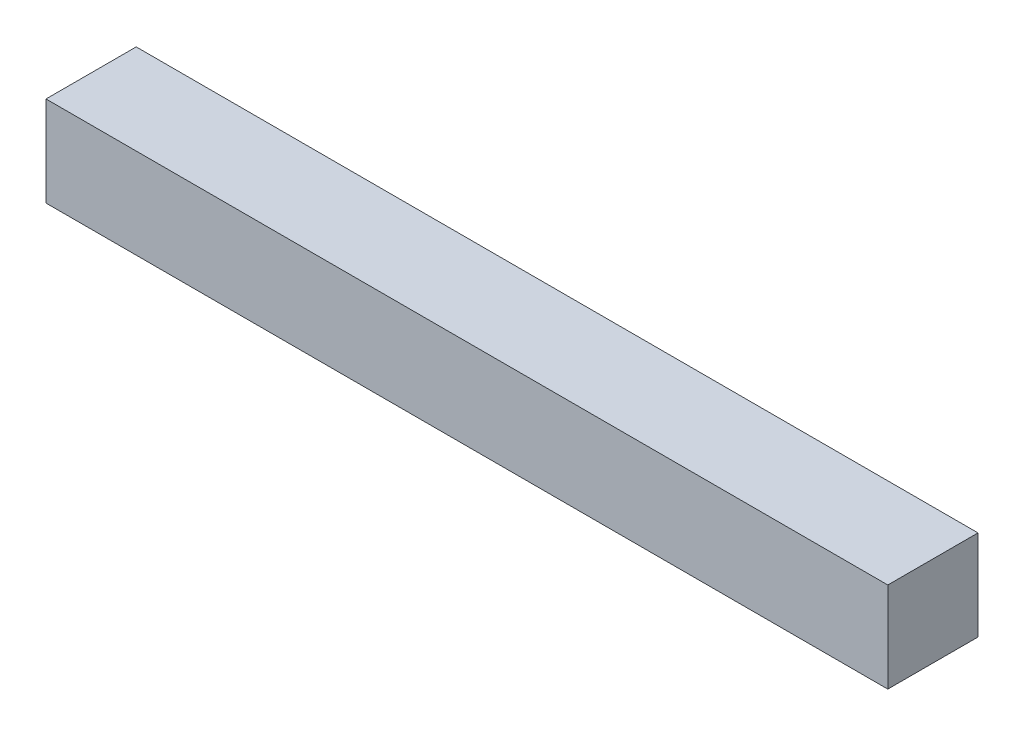
ISO-10303-21;
HEADER;
FILE_DESCRIPTION(('STEP AP214'),'2;1');
FILE_NAME('part.step','',(''),(''),'','','');
FILE_SCHEMA(('AUTOMOTIVE_DESIGN { 1 0 10303 214 1 1 1 1 }'));
ENDSEC;
DATA;
#1=APPLICATION_CONTEXT('core data for automotive mechanical design processes');
#2=APPLICATION_PROTOCOL_DEFINITION('international standard','automotive_design',2000,#1);
#3=PRODUCT_CONTEXT('',#1,'mechanical');
#4=PRODUCT('Part','Part','',(#3));
#5=PRODUCT_RELATED_PRODUCT_CATEGORY('part','',(#4));
#6=PRODUCT_DEFINITION_FORMATION('','',#4);
#7=PRODUCT_DEFINITION_CONTEXT('part definition',#1,'design');
#8=PRODUCT_DEFINITION('design','',#6,#7);
#9=PRODUCT_DEFINITION_SHAPE('','',#8);
#10=(LENGTH_UNIT() NAMED_UNIT(*) SI_UNIT(.MILLI.,.METRE.));
#11=(NAMED_UNIT(*) PLANE_ANGLE_UNIT() SI_UNIT($,.RADIAN.));
#12=(NAMED_UNIT(*) SI_UNIT($,.STERADIAN.) SOLID_ANGLE_UNIT());
#13=UNCERTAINTY_MEASURE_WITH_UNIT(LENGTH_MEASURE(1.E-05),#10,'distance_accuracy_value','');
#14=(GEOMETRIC_REPRESENTATION_CONTEXT(3) GLOBAL_UNCERTAINTY_ASSIGNED_CONTEXT((#13)) GLOBAL_UNIT_ASSIGNED_CONTEXT((#10,
#11,#12)) REPRESENTATION_CONTEXT('',''));
#15=CARTESIAN_POINT('',(0.,0.,0.));
#16=DIRECTION('',(0.,0.,1.));
#17=DIRECTION('',(1.,0.,0.));
#18=AXIS2_PLACEMENT_3D('',#15,#16,#17);
#19=CARTESIAN_POINT('',(355.6,19.05,-19.05));
#20=DIRECTION('',(0.,0.,1.));
#21=DIRECTION('',(0.,-1.,0.));
#22=AXIS2_PLACEMENT_3D('',#19,#20,#21);
#23=PLANE('',#22);
#24=DIRECTION('',(0.,1.,0.));
#25=VECTOR('',#24,1.);
#26=CARTESIAN_POINT('',(0.,19.05,-19.05));
#27=LINE('',#26,#25);
#28=CARTESIAN_POINT('',(0.,-19.05,-19.05));
#29=VERTEX_POINT('',#28);
#30=CARTESIAN_POINT('',(0.,19.05,-19.05));
#31=VERTEX_POINT('',#30);
#32=EDGE_CURVE('E109',#29,#31,#27,.T.);
#33=ORIENTED_EDGE('',*,*,#32,.T.);
#34=DIRECTION('',(-1.,0.,0.));
#35=VECTOR('',#34,1.);
#36=CARTESIAN_POINT('',(355.6,19.05,-19.05));
#37=LINE('',#36,#35);
#38=CARTESIAN_POINT('',(355.6,19.05,-19.05));
#39=VERTEX_POINT('',#38);
#40=EDGE_CURVE('E11',#39,#31,#37,.T.);
#41=ORIENTED_EDGE('',*,*,#40,.F.);
#42=DIRECTION('',(0.,1.,0.));
#43=VECTOR('',#42,1.);
#44=CARTESIAN_POINT('',(355.6,19.05,-19.05));
#45=LINE('',#44,#43);
#46=CARTESIAN_POINT('',(355.6,-19.05,-19.05));
#47=VERTEX_POINT('',#46);
#48=EDGE_CURVE('E93',#47,#39,#45,.T.);
#49=ORIENTED_EDGE('',*,*,#48,.F.);
#50=DIRECTION('',(-1.,0.,0.));
#51=VECTOR('',#50,1.);
#52=CARTESIAN_POINT('',(355.6,-19.05,-19.05));
#53=LINE('',#52,#51);
#54=EDGE_CURVE('E105',#47,#29,#53,.T.);
#55=ORIENTED_EDGE('',*,*,#54,.T.);
#56=EDGE_LOOP('',(#33,#41,#49,#55));
#57=FACE_BOUND('',#56,.T.);
#58=ADVANCED_FACE('F41',(#57),#23,.F.);
#59=CARTESIAN_POINT('',(355.6,19.05,19.05));
#60=DIRECTION('',(0.,-1.,0.));
#61=DIRECTION('',(0.,0.,-1.));
#62=AXIS2_PLACEMENT_3D('',#59,#60,#61);
#63=PLANE('',#62);
#64=DIRECTION('',(0.,0.,1.));
#65=VECTOR('',#64,1.);
#66=CARTESIAN_POINT('',(0.,19.05,19.05));
#67=LINE('',#66,#65);
#68=CARTESIAN_POINT('',(0.,19.05,19.05));
#69=VERTEX_POINT('',#68);
#70=EDGE_CURVE('E98',#31,#69,#67,.T.);
#71=ORIENTED_EDGE('',*,*,#70,.T.);
#72=DIRECTION('',(-1.,0.,0.));
#73=VECTOR('',#72,1.);
#74=CARTESIAN_POINT('',(355.6,19.05,19.05));
#75=LINE('',#74,#73);
#76=CARTESIAN_POINT('',(355.6,19.05,19.05));
#77=VERTEX_POINT('',#76);
#78=EDGE_CURVE('E50',#77,#69,#75,.T.);
#79=ORIENTED_EDGE('',*,*,#78,.F.);
#80=DIRECTION('',(0.,0.,1.));
#81=VECTOR('',#80,1.);
#82=CARTESIAN_POINT('',(355.6,19.05,19.05));
#83=LINE('',#82,#81);
#84=EDGE_CURVE('E88',#39,#77,#83,.T.);
#85=ORIENTED_EDGE('',*,*,#84,.F.);
#86=ORIENTED_EDGE('',*,*,#40,.T.);
#87=EDGE_LOOP('',(#71,#79,#85,#86));
#88=FACE_BOUND('',#87,.T.);
#89=ADVANCED_FACE('F97',(#88),#63,.F.);
#90=CARTESIAN_POINT('',(355.6,19.05,19.05));
#91=DIRECTION('',(0.,0.,-1.));
#92=DIRECTION('',(0.,1.,0.));
#93=AXIS2_PLACEMENT_3D('',#90,#91,#92);
#94=PLANE('',#93);
#95=DIRECTION('',(0.,-1.,0.));
#96=VECTOR('',#95,1.);
#97=CARTESIAN_POINT('',(0.,19.05,19.05));
#98=LINE('',#97,#96);
#99=CARTESIAN_POINT('',(0.,-19.05,19.05));
#100=VERTEX_POINT('',#99);
#101=EDGE_CURVE('E75',#69,#100,#98,.T.);
#102=ORIENTED_EDGE('',*,*,#101,.T.);
#103=DIRECTION('',(-1.,0.,0.));
#104=VECTOR('',#103,1.);
#105=CARTESIAN_POINT('',(355.6,-19.05,19.05));
#106=LINE('',#105,#104);
#107=CARTESIAN_POINT('',(355.6,-19.05,19.05));
#108=VERTEX_POINT('',#107);
#109=EDGE_CURVE('E100',#108,#100,#106,.T.);
#110=ORIENTED_EDGE('',*,*,#109,.F.);
#111=DIRECTION('',(0.,-1.,0.));
#112=VECTOR('',#111,1.);
#113=CARTESIAN_POINT('',(355.6,19.05,19.05));
#114=LINE('',#113,#112);
#115=EDGE_CURVE('E91',#77,#108,#114,.T.);
#116=ORIENTED_EDGE('',*,*,#115,.F.);
#117=ORIENTED_EDGE('',*,*,#78,.T.);
#118=EDGE_LOOP('',(#102,#110,#116,#117));
#119=FACE_BOUND('',#118,.T.);
#120=ADVANCED_FACE('F101',(#119),#94,.F.);
#121=CARTESIAN_POINT('',(355.6,-19.05,19.05));
#122=DIRECTION('',(0.,1.,0.));
#123=DIRECTION('',(0.,0.,1.));
#124=AXIS2_PLACEMENT_3D('',#121,#122,#123);
#125=PLANE('',#124);
#126=DIRECTION('',(0.,0.,-1.));
#127=VECTOR('',#126,1.);
#128=CARTESIAN_POINT('',(0.,-19.05,19.05));
#129=LINE('',#128,#127);
#130=EDGE_CURVE('E81',#100,#29,#129,.T.);
#131=ORIENTED_EDGE('',*,*,#130,.T.);
#132=ORIENTED_EDGE('',*,*,#54,.F.);
#133=DIRECTION('',(0.,0.,-1.));
#134=VECTOR('',#133,1.);
#135=CARTESIAN_POINT('',(355.6,-19.05,19.05));
#136=LINE('',#135,#134);
#137=EDGE_CURVE('E58',#108,#47,#136,.T.);
#138=ORIENTED_EDGE('',*,*,#137,.F.);
#139=ORIENTED_EDGE('',*,*,#109,.T.);
#140=EDGE_LOOP('',(#131,#132,#138,#139));
#141=FACE_BOUND('',#140,.T.);
#142=ADVANCED_FACE('F122',(#141),#125,.F.);
#143=CARTESIAN_POINT('',(355.6,0.,0.));
#144=DIRECTION('',(1.,0.,0.));
#145=DIRECTION('',(0.,0.,-1.));
#146=AXIS2_PLACEMENT_3D('',#143,#144,#145);
#147=PLANE('',#146);
#148=ORIENTED_EDGE('',*,*,#48,.T.);
#149=ORIENTED_EDGE('',*,*,#84,.T.);
#150=ORIENTED_EDGE('',*,*,#115,.T.);
#151=ORIENTED_EDGE('',*,*,#137,.T.);
#152=EDGE_LOOP('',(#148,#149,#150,#151));
#153=FACE_BOUND('',#152,.T.);
#154=ADVANCED_FACE('F89',(#153),#147,.T.);
#155=CARTESIAN_POINT('',(0.,0.,0.));
#156=DIRECTION('',(1.,0.,0.));
#157=DIRECTION('',(0.,0.,-1.));
#158=AXIS2_PLACEMENT_3D('',#155,#156,#157);
#159=PLANE('',#158);
#160=ORIENTED_EDGE('',*,*,#32,.F.);
#161=ORIENTED_EDGE('',*,*,#130,.F.);
#162=ORIENTED_EDGE('',*,*,#101,.F.);
#163=ORIENTED_EDGE('',*,*,#70,.F.);
#164=EDGE_LOOP('',(#160,#161,#162,#163));
#165=FACE_BOUND('',#164,.T.);
#166=ADVANCED_FACE('F125',(#165),#159,.F.);
#167=CLOSED_SHELL('',(#58,#89,#120,#142,#154,#166));
#168=MANIFOLD_SOLID_BREP('B2',#167);
#169=ADVANCED_BREP_SHAPE_REPRESENTATION('',(#18,#168),#14);
#170=SHAPE_DEFINITION_REPRESENTATION(#9,#169);
ENDSEC;
END-ISO-10303-21;
